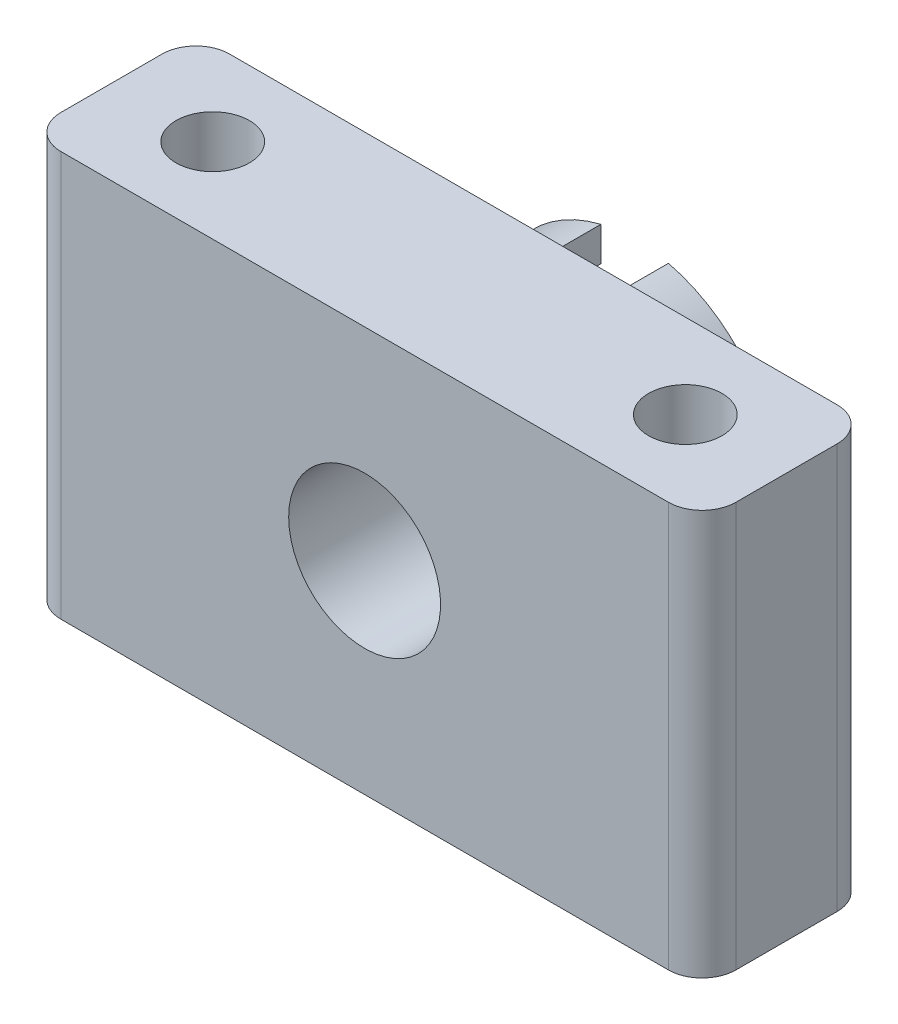
ISO-10303-21;
HEADER;
FILE_DESCRIPTION(('STEP AP214'),'2;1');
FILE_NAME('part.step','',(''),(''),'','','');
FILE_SCHEMA(('AUTOMOTIVE_DESIGN { 1 0 10303 214 1 1 1 1 }'));
ENDSEC;
DATA;
#1=APPLICATION_CONTEXT('core data for automotive mechanical design processes');
#2=APPLICATION_PROTOCOL_DEFINITION('international standard','automotive_design',2000,#1);
#3=PRODUCT_CONTEXT('',#1,'mechanical');
#4=PRODUCT('Part','Part','',(#3));
#5=PRODUCT_RELATED_PRODUCT_CATEGORY('part','',(#4));
#6=PRODUCT_DEFINITION_FORMATION('','',#4);
#7=PRODUCT_DEFINITION_CONTEXT('part definition',#1,'design');
#8=PRODUCT_DEFINITION('design','',#6,#7);
#9=PRODUCT_DEFINITION_SHAPE('','',#8);
#10=(LENGTH_UNIT() NAMED_UNIT(*) SI_UNIT(.MILLI.,.METRE.));
#11=(NAMED_UNIT(*) PLANE_ANGLE_UNIT() SI_UNIT($,.RADIAN.));
#12=(NAMED_UNIT(*) SI_UNIT($,.STERADIAN.) SOLID_ANGLE_UNIT());
#13=UNCERTAINTY_MEASURE_WITH_UNIT(LENGTH_MEASURE(1.E-05),#10,'distance_accuracy_value','');
#14=(GEOMETRIC_REPRESENTATION_CONTEXT(3) GLOBAL_UNCERTAINTY_ASSIGNED_CONTEXT((#13)) GLOBAL_UNIT_ASSIGNED_CONTEXT((#10,
#11,#12)) REPRESENTATION_CONTEXT('',''));
#15=CARTESIAN_POINT('',(0.,0.,0.));
#16=DIRECTION('',(0.,0.,1.));
#17=DIRECTION('',(1.,0.,0.));
#18=AXIS2_PLACEMENT_3D('',#15,#16,#17);
#19=CARTESIAN_POINT('',(0.,0.,0.));
#20=DIRECTION('',(0.,0.,-1.));
#21=DIRECTION('',(-1.,0.,0.));
#22=AXIS2_PLACEMENT_3D('',#19,#20,#21);
#23=PLANE('',#22);
#24=CARTESIAN_POINT('',(0.,0.,0.));
#25=DIRECTION('',(0.,0.,1.));
#26=DIRECTION('',(1.,0.,0.));
#27=AXIS2_PLACEMENT_3D('',#24,#25,#26);
#28=CIRCLE('',#27,6.55);
#29=CARTESIAN_POINT('',(-2.,6.23718686588754,0.));
#30=VERTEX_POINT('',#29);
#31=CARTESIAN_POINT('',(-2.,-6.23718686588753,0.));
#32=VERTEX_POINT('',#31);
#33=EDGE_CURVE('E225',#30,#32,#28,.T.);
#34=ORIENTED_EDGE('',*,*,#33,.T.);
#35=DIRECTION('',(0.,1.,0.));
#36=VECTOR('',#35,1.);
#37=CARTESIAN_POINT('',(-2.,-6.23718686588753,0.));
#38=LINE('',#37,#36);
#39=CARTESIAN_POINT('',(-2.,-8.26135582092915,0.));
#40=VERTEX_POINT('',#39);
#41=EDGE_CURVE('E157',#40,#32,#38,.T.);
#42=ORIENTED_EDGE('',*,*,#41,.F.);
#43=CARTESIAN_POINT('',(0.,0.,0.));
#44=DIRECTION('',(0.,0.,1.));
#45=DIRECTION('',(1.,0.,0.));
#46=AXIS2_PLACEMENT_3D('',#43,#44,#45);
#47=CIRCLE('',#46,8.5);
#48=CARTESIAN_POINT('',(-2.,8.26135582092916,0.));
#49=VERTEX_POINT('',#48);
#50=EDGE_CURVE('E229',#49,#40,#47,.T.);
#51=ORIENTED_EDGE('',*,*,#50,.F.);
#52=DIRECTION('',(0.,1.,0.));
#53=VECTOR('',#52,1.);
#54=CARTESIAN_POINT('',(-2.,8.26135582092916,0.));
#55=LINE('',#54,#53);
#56=EDGE_CURVE('E152',#30,#49,#55,.T.);
#57=ORIENTED_EDGE('',*,*,#56,.F.);
#58=EDGE_LOOP('',(#34,#42,#51,#57));
#59=FACE_BOUND('',#58,.T.);
#60=ADVANCED_FACE('F16',(#59),#23,.T.);
#61=CARTESIAN_POINT('',(0.,0.,0.));
#62=DIRECTION('',(0.,0.,-1.));
#63=DIRECTION('',(-1.,0.,0.));
#64=AXIS2_PLACEMENT_3D('',#61,#62,#63);
#65=PLANE('',#64);
#66=DIRECTION('',(0.,-1.,0.));
#67=VECTOR('',#66,1.);
#68=CARTESIAN_POINT('',(2.,-6.23718686588753,0.));
#69=LINE('',#68,#67);
#70=CARTESIAN_POINT('',(2.,-6.23718686588753,0.));
#71=VERTEX_POINT('',#70);
#72=CARTESIAN_POINT('',(2.,-8.26135582092915,0.));
#73=VERTEX_POINT('',#72);
#74=EDGE_CURVE('E127',#71,#73,#69,.T.);
#75=ORIENTED_EDGE('',*,*,#74,.F.);
#76=CARTESIAN_POINT('',(0.,0.,0.));
#77=DIRECTION('',(0.,0.,1.));
#78=DIRECTION('',(1.,0.,0.));
#79=AXIS2_PLACEMENT_3D('',#76,#77,#78);
#80=CIRCLE('',#79,6.55);
#81=CARTESIAN_POINT('',(2.,6.23718686588754,0.));
#82=VERTEX_POINT('',#81);
#83=EDGE_CURVE('E155',#71,#82,#80,.T.);
#84=ORIENTED_EDGE('',*,*,#83,.T.);
#85=DIRECTION('',(0.,-1.,0.));
#86=VECTOR('',#85,1.);
#87=CARTESIAN_POINT('',(2.,8.26135582092916,0.));
#88=LINE('',#87,#86);
#89=CARTESIAN_POINT('',(2.,8.26135582092916,0.));
#90=VERTEX_POINT('',#89);
#91=EDGE_CURVE('E130',#90,#82,#88,.T.);
#92=ORIENTED_EDGE('',*,*,#91,.F.);
#93=CARTESIAN_POINT('',(0.,0.,0.));
#94=DIRECTION('',(0.,0.,1.));
#95=DIRECTION('',(1.,0.,0.));
#96=AXIS2_PLACEMENT_3D('',#93,#94,#95);
#97=CIRCLE('',#96,8.5);
#98=EDGE_CURVE('E19',#73,#90,#97,.T.);
#99=ORIENTED_EDGE('',*,*,#98,.F.);
#100=EDGE_LOOP('',(#75,#84,#92,#99));
#101=FACE_BOUND('',#100,.T.);
#102=ADVANCED_FACE('F126',(#101),#65,.T.);
#103=CARTESIAN_POINT('',(0.,0.,-2.00000000000003));
#104=DIRECTION('',(0.,0.,1.));
#105=DIRECTION('',(1.,0.,0.));
#106=AXIS2_PLACEMENT_3D('',#103,#104,#105);
#107=CYLINDRICAL_SURFACE('',#106,8.5);
#108=CARTESIAN_POINT('',(0.,0.,6.));
#109=DIRECTION('',(0.,0.,1.));
#110=DIRECTION('',(1.,0.,0.));
#111=AXIS2_PLACEMENT_3D('',#108,#109,#110);
#112=CIRCLE('',#111,8.5);
#113=CARTESIAN_POINT('',(2.,8.26135582092916,6.));
#114=VERTEX_POINT('',#113);
#115=CARTESIAN_POINT('',(2.,-8.26135582092915,6.));
#116=VERTEX_POINT('',#115);
#117=EDGE_CURVE('E144',#114,#116,#112,.F.);
#118=ORIENTED_EDGE('',*,*,#117,.T.);
#119=DIRECTION('',(0.,0.,1.));
#120=VECTOR('',#119,1.);
#121=CARTESIAN_POINT('',(2.,-8.26135582092915,-2.00000000000003));
#122=LINE('',#121,#120);
#123=EDGE_CURVE('E135',#73,#116,#122,.T.);
#124=ORIENTED_EDGE('',*,*,#123,.F.);
#125=ORIENTED_EDGE('',*,*,#98,.T.);
#126=DIRECTION('',(0.,0.,1.));
#127=VECTOR('',#126,1.);
#128=CARTESIAN_POINT('',(2.,8.26135582092916,-2.00000000000003));
#129=LINE('',#128,#127);
#130=EDGE_CURVE('E151',#114,#90,#129,.F.);
#131=ORIENTED_EDGE('',*,*,#130,.F.);
#132=EDGE_LOOP('',(#118,#124,#125,#131));
#133=FACE_BOUND('',#132,.T.);
#134=ADVANCED_FACE('F143',(#133),#107,.T.);
#135=CARTESIAN_POINT('',(2.,-6.23718686588753,-2.00000000000003));
#136=DIRECTION('',(-1.,0.,0.));
#137=DIRECTION('',(0.,-1.,0.));
#138=AXIS2_PLACEMENT_3D('',#135,#136,#137);
#139=PLANE('',#138);
#140=DIRECTION('',(0.,0.,1.));
#141=VECTOR('',#140,1.);
#142=CARTESIAN_POINT('',(2.,-6.23718686588753,-2.00000000000003));
#143=LINE('',#142,#141);
#144=CARTESIAN_POINT('',(2.,-6.23718686588753,6.));
#145=VERTEX_POINT('',#144);
#146=EDGE_CURVE('E140',#145,#71,#143,.F.);
#147=ORIENTED_EDGE('',*,*,#146,.T.);
#148=ORIENTED_EDGE('',*,*,#74,.T.);
#149=ORIENTED_EDGE('',*,*,#123,.T.);
#150=DIRECTION('',(0.,1.,0.));
#151=VECTOR('',#150,1.);
#152=CARTESIAN_POINT('',(2.,0.,6.));
#153=LINE('',#152,#151);
#154=EDGE_CURVE('E219',#116,#145,#153,.T.);
#155=ORIENTED_EDGE('',*,*,#154,.T.);
#156=EDGE_LOOP('',(#147,#148,#149,#155));
#157=FACE_BOUND('',#156,.T.);
#158=ADVANCED_FACE('F137',(#157),#139,.T.);
#159=CARTESIAN_POINT('',(-2.,-6.23718686588753,-2.00000000000003));
#160=DIRECTION('',(1.,0.,0.));
#161=DIRECTION('',(0.,0.,-1.));
#162=AXIS2_PLACEMENT_3D('',#159,#160,#161);
#163=PLANE('',#162);
#164=DIRECTION('',(0.,0.,1.));
#165=VECTOR('',#164,1.);
#166=CARTESIAN_POINT('',(-2.,-8.26135582092915,-2.00000000000003));
#167=LINE('',#166,#165);
#168=CARTESIAN_POINT('',(-2.,-8.26135582092915,6.));
#169=VERTEX_POINT('',#168);
#170=EDGE_CURVE('E159',#40,#169,#167,.T.);
#171=ORIENTED_EDGE('',*,*,#170,.F.);
#172=ORIENTED_EDGE('',*,*,#41,.T.);
#173=DIRECTION('',(0.,0.,-1.));
#174=VECTOR('',#173,1.);
#175=CARTESIAN_POINT('',(-2.,-6.23718686588753,-2.00000000000003));
#176=LINE('',#175,#174);
#177=CARTESIAN_POINT('',(-2.,-6.23718686588753,6.));
#178=VERTEX_POINT('',#177);
#179=EDGE_CURVE('E160',#32,#178,#176,.F.);
#180=ORIENTED_EDGE('',*,*,#179,.T.);
#181=DIRECTION('',(0.,1.,0.));
#182=VECTOR('',#181,1.);
#183=CARTESIAN_POINT('',(-2.,0.,6.));
#184=LINE('',#183,#182);
#185=EDGE_CURVE('E215',#178,#169,#184,.F.);
#186=ORIENTED_EDGE('',*,*,#185,.T.);
#187=EDGE_LOOP('',(#171,#172,#180,#186));
#188=FACE_BOUND('',#187,.T.);
#189=ADVANCED_FACE('F242',(#188),#163,.T.);
#190=CARTESIAN_POINT('',(0.,0.,-2.00000000000003));
#191=DIRECTION('',(0.,0.,1.));
#192=DIRECTION('',(1.,0.,0.));
#193=AXIS2_PLACEMENT_3D('',#190,#191,#192);
#194=CYLINDRICAL_SURFACE('',#193,8.5);
#195=DIRECTION('',(0.,0.,1.));
#196=VECTOR('',#195,1.);
#197=CARTESIAN_POINT('',(-2.,8.26135582092916,-2.00000000000003));
#198=LINE('',#197,#196);
#199=CARTESIAN_POINT('',(-2.,8.26135582092916,6.));
#200=VERTEX_POINT('',#199);
#201=EDGE_CURVE('E156',#49,#200,#198,.T.);
#202=ORIENTED_EDGE('',*,*,#201,.F.);
#203=ORIENTED_EDGE('',*,*,#50,.T.);
#204=ORIENTED_EDGE('',*,*,#170,.T.);
#205=CARTESIAN_POINT('',(0.,0.,6.));
#206=DIRECTION('',(0.,0.,1.));
#207=DIRECTION('',(1.,0.,0.));
#208=AXIS2_PLACEMENT_3D('',#205,#206,#207);
#209=CIRCLE('',#208,8.5);
#210=EDGE_CURVE('E212',#169,#200,#209,.F.);
#211=ORIENTED_EDGE('',*,*,#210,.T.);
#212=EDGE_LOOP('',(#202,#203,#204,#211));
#213=FACE_BOUND('',#212,.T.);
#214=ADVANCED_FACE('F382',(#213),#194,.T.);
#215=CARTESIAN_POINT('',(-2.,8.26135582092916,-2.00000000000003));
#216=DIRECTION('',(1.,0.,0.));
#217=DIRECTION('',(0.,1.,0.));
#218=AXIS2_PLACEMENT_3D('',#215,#216,#217);
#219=PLANE('',#218);
#220=DIRECTION('',(0.,0.,1.));
#221=VECTOR('',#220,1.);
#222=CARTESIAN_POINT('',(-2.,6.23718686588754,-2.00000000000003));
#223=LINE('',#222,#221);
#224=CARTESIAN_POINT('',(-2.,6.23718686588754,6.));
#225=VERTEX_POINT('',#224);
#226=EDGE_CURVE('E228',#225,#30,#223,.F.);
#227=ORIENTED_EDGE('',*,*,#226,.T.);
#228=ORIENTED_EDGE('',*,*,#56,.T.);
#229=ORIENTED_EDGE('',*,*,#201,.T.);
#230=DIRECTION('',(0.,1.,0.));
#231=VECTOR('',#230,1.);
#232=CARTESIAN_POINT('',(-2.,0.,6.));
#233=LINE('',#232,#231);
#234=EDGE_CURVE('E211',#200,#225,#233,.F.);
#235=ORIENTED_EDGE('',*,*,#234,.T.);
#236=EDGE_LOOP('',(#227,#228,#229,#235));
#237=FACE_BOUND('',#236,.T.);
#238=ADVANCED_FACE('F265',(#237),#219,.T.);
#239=CARTESIAN_POINT('',(0.,0.,-2.00000000000003));
#240=DIRECTION('',(0.,0.,1.));
#241=DIRECTION('',(1.,0.,0.));
#242=AXIS2_PLACEMENT_3D('',#239,#240,#241);
#243=CYLINDRICAL_SURFACE('',#242,6.55);
#244=ORIENTED_EDGE('',*,*,#83,.F.);
#245=ORIENTED_EDGE('',*,*,#146,.F.);
#246=CARTESIAN_POINT('',(0.,0.,6.));
#247=DIRECTION('',(0.,0.,1.));
#248=DIRECTION('',(1.,0.,0.));
#249=AXIS2_PLACEMENT_3D('',#246,#247,#248);
#250=CIRCLE('',#249,6.55);
#251=EDGE_CURVE('E216',#145,#178,#250,.F.);
#252=ORIENTED_EDGE('',*,*,#251,.T.);
#253=ORIENTED_EDGE('',*,*,#179,.F.);
#254=ORIENTED_EDGE('',*,*,#33,.F.);
#255=ORIENTED_EDGE('',*,*,#226,.F.);
#256=CARTESIAN_POINT('',(0.,0.,6.));
#257=DIRECTION('',(0.,0.,1.));
#258=DIRECTION('',(1.,0.,0.));
#259=AXIS2_PLACEMENT_3D('',#256,#257,#258);
#260=CIRCLE('',#259,6.55);
#261=CARTESIAN_POINT('',(2.,6.23718686588754,6.));
#262=VERTEX_POINT('',#261);
#263=EDGE_CURVE('E208',#225,#262,#260,.F.);
#264=ORIENTED_EDGE('',*,*,#263,.T.);
#265=DIRECTION('',(0.,0.,1.));
#266=VECTOR('',#265,1.);
#267=CARTESIAN_POINT('',(2.,6.23718686588754,-2.00000000000003));
#268=LINE('',#267,#266);
#269=EDGE_CURVE('E227',#82,#262,#268,.T.);
#270=ORIENTED_EDGE('',*,*,#269,.F.);
#271=EDGE_LOOP('',(#244,#245,#252,#253,#254,#255,#264,#270));
#272=FACE_BOUND('',#271,.T.);
#273=CARTESIAN_POINT('',(0.,0.,9.));
#274=DIRECTION('',(0.,0.,1.));
#275=DIRECTION('',(1.,0.,0.));
#276=AXIS2_PLACEMENT_3D('',#273,#274,#275);
#277=CIRCLE('',#276,6.55);
#278=CARTESIAN_POINT('',(6.54999999999999,0.,9.));
#279=VERTEX_POINT('',#278);
#280=EDGE_CURVE('E150',#279,#279,#277,.F.);
#281=ORIENTED_EDGE('',*,*,#280,.F.);
#282=EDGE_LOOP('',(#281));
#283=FACE_BOUND('',#282,.T.);
#284=ADVANCED_FACE('F252',(#272,#283),#243,.F.);
#285=CARTESIAN_POINT('',(2.,8.26135582092916,-2.00000000000003));
#286=DIRECTION('',(-1.,0.,0.));
#287=DIRECTION('',(0.,-1.,0.));
#288=AXIS2_PLACEMENT_3D('',#285,#286,#287);
#289=PLANE('',#288);
#290=ORIENTED_EDGE('',*,*,#130,.T.);
#291=ORIENTED_EDGE('',*,*,#91,.T.);
#292=ORIENTED_EDGE('',*,*,#269,.T.);
#293=DIRECTION('',(0.,1.,0.));
#294=VECTOR('',#293,1.);
#295=CARTESIAN_POINT('',(2.,0.,6.));
#296=LINE('',#295,#294);
#297=EDGE_CURVE('E207',#262,#114,#296,.T.);
#298=ORIENTED_EDGE('',*,*,#297,.T.);
#299=EDGE_LOOP('',(#290,#291,#292,#298));
#300=FACE_BOUND('',#299,.T.);
#301=ADVANCED_FACE('F256',(#300),#289,.T.);
#302=CARTESIAN_POINT('',(0.,0.,9.));
#303=DIRECTION('',(0.,0.,-1.));
#304=DIRECTION('',(-1.,0.,0.));
#305=AXIS2_PLACEMENT_3D('',#302,#303,#304);
#306=PLANE('',#305);
#307=ORIENTED_EDGE('',*,*,#280,.T.);
#308=EDGE_LOOP('',(#307));
#309=FACE_BOUND('',#308,.T.);
#310=CARTESIAN_POINT('',(0.,0.,9.));
#311=DIRECTION('',(0.,0.,-1.));
#312=DIRECTION('',(-1.,0.,0.));
#313=AXIS2_PLACEMENT_3D('',#310,#311,#312);
#314=CIRCLE('',#313,4.5);
#315=CARTESIAN_POINT('',(-4.5,0.,9.));
#316=VERTEX_POINT('',#315);
#317=EDGE_CURVE('E204',#316,#316,#314,.F.);
#318=ORIENTED_EDGE('',*,*,#317,.T.);
#319=EDGE_LOOP('',(#318));
#320=FACE_BOUND('',#319,.T.);
#321=ADVANCED_FACE('F363',(#309,#320),#306,.T.);
#322=CARTESIAN_POINT('',(-14.,-28.,11.));
#323=DIRECTION('',(0.,1.,0.));
#324=DIRECTION('',(0.,0.,1.));
#325=AXIS2_PLACEMENT_3D('',#322,#323,#324);
#326=CYLINDRICAL_SURFACE('',#325,2.175);
#327=CARTESIAN_POINT('',(-14.,-12.,11.));
#328=DIRECTION('',(0.,1.,0.));
#329=DIRECTION('',(0.,0.,1.));
#330=AXIS2_PLACEMENT_3D('',#327,#328,#329);
#331=CIRCLE('',#330,2.175);
#332=CARTESIAN_POINT('',(-14.,-12.,13.175));
#333=VERTEX_POINT('',#332);
#334=EDGE_CURVE('E182',#333,#333,#331,.F.);
#335=ORIENTED_EDGE('',*,*,#334,.T.);
#336=EDGE_LOOP('',(#335));
#337=FACE_BOUND('',#336,.T.);
#338=CARTESIAN_POINT('',(-14.,12.,11.));
#339=DIRECTION('',(0.,1.,0.));
#340=DIRECTION('',(0.,0.,1.));
#341=AXIS2_PLACEMENT_3D('',#338,#339,#340);
#342=CIRCLE('',#341,2.175);
#343=CARTESIAN_POINT('',(-14.,12.,13.175));
#344=VERTEX_POINT('',#343);
#345=EDGE_CURVE('E200',#344,#344,#342,.F.);
#346=ORIENTED_EDGE('',*,*,#345,.F.);
#347=EDGE_LOOP('',(#346));
#348=FACE_BOUND('',#347,.T.);
#349=ADVANCED_FACE('F365',(#337,#348),#326,.F.);
#350=CARTESIAN_POINT('',(14.,-28.,11.));
#351=DIRECTION('',(0.,1.,0.));
#352=DIRECTION('',(0.,0.,1.));
#353=AXIS2_PLACEMENT_3D('',#350,#351,#352);
#354=CYLINDRICAL_SURFACE('',#353,2.175);
#355=CARTESIAN_POINT('',(14.,-12.,11.));
#356=DIRECTION('',(0.,1.,0.));
#357=DIRECTION('',(0.,0.,1.));
#358=AXIS2_PLACEMENT_3D('',#355,#356,#357);
#359=CIRCLE('',#358,2.175);
#360=CARTESIAN_POINT('',(14.,-12.,13.175));
#361=VERTEX_POINT('',#360);
#362=EDGE_CURVE('E179',#361,#361,#359,.F.);
#363=ORIENTED_EDGE('',*,*,#362,.T.);
#364=EDGE_LOOP('',(#363));
#365=FACE_BOUND('',#364,.T.);
#366=CARTESIAN_POINT('',(14.,12.,11.));
#367=DIRECTION('',(0.,1.,0.));
#368=DIRECTION('',(0.,0.,1.));
#369=AXIS2_PLACEMENT_3D('',#366,#367,#368);
#370=CIRCLE('',#369,2.175);
#371=CARTESIAN_POINT('',(14.,12.,13.175));
#372=VERTEX_POINT('',#371);
#373=EDGE_CURVE('E197',#372,#372,#370,.F.);
#374=ORIENTED_EDGE('',*,*,#373,.F.);
#375=EDGE_LOOP('',(#374));
#376=FACE_BOUND('',#375,.T.);
#377=ADVANCED_FACE('F372',(#365,#376),#354,.F.);
#378=CARTESIAN_POINT('',(-18.,12.,8.));
#379=DIRECTION('',(0.,-1.,0.));
#380=DIRECTION('',(1.,0.,0.));
#381=AXIS2_PLACEMENT_3D('',#378,#379,#380);
#382=CYLINDRICAL_SURFACE('',#381,2.);
#383=CARTESIAN_POINT('',(-18.,-12.,8.));
#384=DIRECTION('',(0.,-1.,0.));
#385=DIRECTION('',(1.,0.,0.));
#386=AXIS2_PLACEMENT_3D('',#383,#384,#385);
#387=CIRCLE('',#386,2.);
#388=CARTESIAN_POINT('',(-18.,-12.,6.));
#389=VERTEX_POINT('',#388);
#390=CARTESIAN_POINT('',(-20.,-12.,8.));
#391=VERTEX_POINT('',#390);
#392=EDGE_CURVE('E176',#389,#391,#387,.F.);
#393=ORIENTED_EDGE('',*,*,#392,.T.);
#394=DIRECTION('',(0.,1.,0.));
#395=VECTOR('',#394,1.);
#396=CARTESIAN_POINT('',(-20.,12.,8.));
#397=LINE('',#396,#395);
#398=CARTESIAN_POINT('',(-20.,12.,8.));
#399=VERTEX_POINT('',#398);
#400=EDGE_CURVE('E224',#391,#399,#397,.T.);
#401=ORIENTED_EDGE('',*,*,#400,.T.);
#402=CARTESIAN_POINT('',(-18.,12.,8.));
#403=DIRECTION('',(0.,-1.,0.));
#404=DIRECTION('',(1.,0.,0.));
#405=AXIS2_PLACEMENT_3D('',#402,#403,#404);
#406=CIRCLE('',#405,2.);
#407=CARTESIAN_POINT('',(-18.,12.,6.));
#408=VERTEX_POINT('',#407);
#409=EDGE_CURVE('E191',#408,#399,#406,.F.);
#410=ORIENTED_EDGE('',*,*,#409,.F.);
#411=DIRECTION('',(0.,1.,0.));
#412=VECTOR('',#411,1.);
#413=CARTESIAN_POINT('',(-18.,0.,6.));
#414=LINE('',#413,#412);
#415=EDGE_CURVE('E274',#408,#389,#414,.F.);
#416=ORIENTED_EDGE('',*,*,#415,.T.);
#417=EDGE_LOOP('',(#393,#401,#410,#416));
#418=FACE_BOUND('',#417,.T.);
#419=ADVANCED_FACE('F286',(#418),#382,.T.);
#420=CARTESIAN_POINT('',(-20.,12.,16.));
#421=DIRECTION('',(1.,0.,0.));
#422=DIRECTION('',(0.,1.,0.));
#423=AXIS2_PLACEMENT_3D('',#420,#421,#422);
#424=PLANE('',#423);
#425=ORIENTED_EDGE('',*,*,#400,.F.);
#426=DIRECTION('',(0.,0.,1.));
#427=VECTOR('',#426,1.);
#428=CARTESIAN_POINT('',(-20.,-12.,16.));
#429=LINE('',#428,#427);
#430=CARTESIAN_POINT('',(-20.,-12.,14.));
#431=VERTEX_POINT('',#430);
#432=EDGE_CURVE('E175',#391,#431,#429,.T.);
#433=ORIENTED_EDGE('',*,*,#432,.T.);
#434=DIRECTION('',(0.,-1.,0.));
#435=VECTOR('',#434,1.);
#436=CARTESIAN_POINT('',(-20.,0.,14.));
#437=LINE('',#436,#435);
#438=CARTESIAN_POINT('',(-20.,12.,14.));
#439=VERTEX_POINT('',#438);
#440=EDGE_CURVE('E203',#439,#431,#437,.T.);
#441=ORIENTED_EDGE('',*,*,#440,.F.);
#442=DIRECTION('',(0.,0.,1.));
#443=VECTOR('',#442,1.);
#444=CARTESIAN_POINT('',(-20.,12.,16.));
#445=LINE('',#444,#443);
#446=EDGE_CURVE('E190',#399,#439,#445,.T.);
#447=ORIENTED_EDGE('',*,*,#446,.F.);
#448=EDGE_LOOP('',(#425,#433,#441,#447));
#449=FACE_BOUND('',#448,.T.);
#450=ADVANCED_FACE('F291',(#449),#424,.F.);
#451=CARTESIAN_POINT('',(20.,12.,16.));
#452=DIRECTION('',(1.,0.,0.));
#453=DIRECTION('',(0.,1.,0.));
#454=AXIS2_PLACEMENT_3D('',#451,#452,#453);
#455=PLANE('',#454);
#456=DIRECTION('',(0.,0.,1.));
#457=VECTOR('',#456,1.);
#458=CARTESIAN_POINT('',(20.,12.,16.));
#459=LINE('',#458,#457);
#460=CARTESIAN_POINT('',(20.,12.,14.));
#461=VERTEX_POINT('',#460);
#462=CARTESIAN_POINT('',(20.,12.,8.));
#463=VERTEX_POINT('',#462);
#464=EDGE_CURVE('E196',#461,#463,#459,.F.);
#465=ORIENTED_EDGE('',*,*,#464,.F.);
#466=DIRECTION('',(0.,1.,0.));
#467=VECTOR('',#466,1.);
#468=CARTESIAN_POINT('',(20.,12.,14.));
#469=LINE('',#468,#467);
#470=CARTESIAN_POINT('',(20.,-12.,14.));
#471=VERTEX_POINT('',#470);
#472=EDGE_CURVE('E185',#471,#461,#469,.T.);
#473=ORIENTED_EDGE('',*,*,#472,.F.);
#474=DIRECTION('',(0.,0.,1.));
#475=VECTOR('',#474,1.);
#476=CARTESIAN_POINT('',(20.,-12.,16.));
#477=LINE('',#476,#475);
#478=CARTESIAN_POINT('',(20.,-12.,8.));
#479=VERTEX_POINT('',#478);
#480=EDGE_CURVE('E170',#471,#479,#477,.F.);
#481=ORIENTED_EDGE('',*,*,#480,.T.);
#482=DIRECTION('',(0.,-1.,0.));
#483=VECTOR('',#482,1.);
#484=CARTESIAN_POINT('',(20.,12.,8.));
#485=LINE('',#484,#483);
#486=EDGE_CURVE('E277',#463,#479,#485,.T.);
#487=ORIENTED_EDGE('',*,*,#486,.F.);
#488=EDGE_LOOP('',(#465,#473,#481,#487));
#489=FACE_BOUND('',#488,.T.);
#490=ADVANCED_FACE('F325',(#489),#455,.T.);
#491=CARTESIAN_POINT('',(18.,12.,8.));
#492=DIRECTION('',(0.,-1.,0.));
#493=DIRECTION('',(1.,0.,0.));
#494=AXIS2_PLACEMENT_3D('',#491,#492,#493);
#495=CYLINDRICAL_SURFACE('',#494,2.);
#496=CARTESIAN_POINT('',(18.,12.,8.));
#497=DIRECTION('',(0.,-1.,0.));
#498=DIRECTION('',(1.,0.,0.));
#499=AXIS2_PLACEMENT_3D('',#496,#497,#498);
#500=CIRCLE('',#499,2.);
#501=CARTESIAN_POINT('',(18.,12.,6.));
#502=VERTEX_POINT('',#501);
#503=EDGE_CURVE('E194',#463,#502,#500,.F.);
#504=ORIENTED_EDGE('',*,*,#503,.F.);
#505=ORIENTED_EDGE('',*,*,#486,.T.);
#506=CARTESIAN_POINT('',(18.,-12.,8.));
#507=DIRECTION('',(0.,-1.,0.));
#508=DIRECTION('',(1.,0.,0.));
#509=AXIS2_PLACEMENT_3D('',#506,#507,#508);
#510=CIRCLE('',#509,2.);
#511=CARTESIAN_POINT('',(18.,-12.,6.));
#512=VERTEX_POINT('',#511);
#513=EDGE_CURVE('E167',#479,#512,#510,.F.);
#514=ORIENTED_EDGE('',*,*,#513,.T.);
#515=DIRECTION('',(0.,1.,0.));
#516=VECTOR('',#515,1.);
#517=CARTESIAN_POINT('',(18.,0.,6.));
#518=LINE('',#517,#516);
#519=EDGE_CURVE('E221',#512,#502,#518,.T.);
#520=ORIENTED_EDGE('',*,*,#519,.T.);
#521=EDGE_LOOP('',(#504,#505,#514,#520));
#522=FACE_BOUND('',#521,.T.);
#523=ADVANCED_FACE('F330',(#522),#495,.T.);
#524=CARTESIAN_POINT('',(0.,0.,6.));
#525=DIRECTION('',(0.,0.,1.));
#526=DIRECTION('',(1.,0.,0.));
#527=AXIS2_PLACEMENT_3D('',#524,#525,#526);
#528=PLANE('',#527);
#529=ORIENTED_EDGE('',*,*,#263,.F.);
#530=ORIENTED_EDGE('',*,*,#234,.F.);
#531=ORIENTED_EDGE('',*,*,#210,.F.);
#532=ORIENTED_EDGE('',*,*,#185,.F.);
#533=ORIENTED_EDGE('',*,*,#251,.F.);
#534=ORIENTED_EDGE('',*,*,#154,.F.);
#535=ORIENTED_EDGE('',*,*,#117,.F.);
#536=ORIENTED_EDGE('',*,*,#297,.F.);
#537=EDGE_LOOP('',(#529,#530,#531,#532,#533,#534,#535,#536));
#538=FACE_BOUND('',#537,.T.);
#539=ORIENTED_EDGE('',*,*,#519,.F.);
#540=DIRECTION('',(1.,0.,0.));
#541=VECTOR('',#540,1.);
#542=CARTESIAN_POINT('',(-20.,-12.,6.));
#543=LINE('',#542,#541);
#544=EDGE_CURVE('E166',#512,#389,#543,.F.);
#545=ORIENTED_EDGE('',*,*,#544,.T.);
#546=ORIENTED_EDGE('',*,*,#415,.F.);
#547=DIRECTION('',(-1.,0.,0.));
#548=VECTOR('',#547,1.);
#549=CARTESIAN_POINT('',(-20.,12.,6.));
#550=LINE('',#549,#548);
#551=EDGE_CURVE('E193',#502,#408,#550,.T.);
#552=ORIENTED_EDGE('',*,*,#551,.F.);
#553=EDGE_LOOP('',(#539,#545,#546,#552));
#554=FACE_BOUND('',#553,.T.);
#555=ADVANCED_FACE('F248',(#538,#554),#528,.F.);
#556=CARTESIAN_POINT('',(0.,0.,18.));
#557=DIRECTION('',(0.,0.,-1.));
#558=DIRECTION('',(-1.,0.,0.));
#559=AXIS2_PLACEMENT_3D('',#556,#557,#558);
#560=CYLINDRICAL_SURFACE('',#559,4.5);
#561=CARTESIAN_POINT('',(0.,0.,16.));
#562=DIRECTION('',(0.,0.,-1.));
#563=DIRECTION('',(-1.,0.,0.));
#564=AXIS2_PLACEMENT_3D('',#561,#562,#563);
#565=CIRCLE('',#564,4.5);
#566=CARTESIAN_POINT('',(-4.5,0.,16.));
#567=VERTEX_POINT('',#566);
#568=EDGE_CURVE('E162',#567,#567,#565,.F.);
#569=ORIENTED_EDGE('',*,*,#568,.T.);
#570=EDGE_LOOP('',(#569));
#571=FACE_BOUND('',#570,.T.);
#572=ORIENTED_EDGE('',*,*,#317,.F.);
#573=EDGE_LOOP('',(#572));
#574=FACE_BOUND('',#573,.T.);
#575=ADVANCED_FACE('F338',(#571,#574),#560,.F.);
#576=CARTESIAN_POINT('',(-18.,0.,14.));
#577=DIRECTION('',(0.,-1.,0.));
#578=DIRECTION('',(1.,0.,0.));
#579=AXIS2_PLACEMENT_3D('',#576,#577,#578);
#580=CYLINDRICAL_SURFACE('',#579,2.);
#581=CARTESIAN_POINT('',(-18.,-12.,14.));
#582=DIRECTION('',(0.,-1.,0.));
#583=DIRECTION('',(1.,0.,0.));
#584=AXIS2_PLACEMENT_3D('',#581,#582,#583);
#585=CIRCLE('',#584,2.);
#586=CARTESIAN_POINT('',(-18.,-12.,16.));
#587=VERTEX_POINT('',#586);
#588=EDGE_CURVE('E172',#431,#587,#585,.F.);
#589=ORIENTED_EDGE('',*,*,#588,.T.);
#590=DIRECTION('',(0.,1.,0.));
#591=VECTOR('',#590,1.);
#592=CARTESIAN_POINT('',(-18.,0.,16.));
#593=LINE('',#592,#591);
#594=CARTESIAN_POINT('',(-18.,12.,16.));
#595=VERTEX_POINT('',#594);
#596=EDGE_CURVE('E165',#587,#595,#593,.T.);
#597=ORIENTED_EDGE('',*,*,#596,.T.);
#598=CARTESIAN_POINT('',(-18.,12.,14.));
#599=DIRECTION('',(0.,-1.,0.));
#600=DIRECTION('',(1.,0.,0.));
#601=AXIS2_PLACEMENT_3D('',#598,#599,#600);
#602=CIRCLE('',#601,2.);
#603=EDGE_CURVE('E188',#439,#595,#602,.F.);
#604=ORIENTED_EDGE('',*,*,#603,.F.);
#605=ORIENTED_EDGE('',*,*,#440,.T.);
#606=EDGE_LOOP('',(#589,#597,#604,#605));
#607=FACE_BOUND('',#606,.T.);
#608=ADVANCED_FACE('F352',(#607),#580,.T.);
#609=CARTESIAN_POINT('',(-20.,12.,16.));
#610=DIRECTION('',(0.,1.,0.));
#611=DIRECTION('',(-1.,0.,0.));
#612=AXIS2_PLACEMENT_3D('',#609,#610,#611);
#613=PLANE('',#612);
#614=DIRECTION('',(-1.,0.,0.));
#615=VECTOR('',#614,1.);
#616=CARTESIAN_POINT('',(0.,12.,16.));
#617=LINE('',#616,#615);
#618=CARTESIAN_POINT('',(18.,12.,16.));
#619=VERTEX_POINT('',#618);
#620=EDGE_CURVE('E296',#595,#619,#617,.F.);
#621=ORIENTED_EDGE('',*,*,#620,.T.);
#622=CARTESIAN_POINT('',(18.,12.,14.));
#623=DIRECTION('',(0.,1.,0.));
#624=DIRECTION('',(-1.,0.,0.));
#625=AXIS2_PLACEMENT_3D('',#622,#623,#624);
#626=CIRCLE('',#625,2.);
#627=EDGE_CURVE('E186',#461,#619,#626,.F.);
#628=ORIENTED_EDGE('',*,*,#627,.F.);
#629=ORIENTED_EDGE('',*,*,#464,.T.);
#630=ORIENTED_EDGE('',*,*,#503,.T.);
#631=ORIENTED_EDGE('',*,*,#551,.T.);
#632=ORIENTED_EDGE('',*,*,#409,.T.);
#633=ORIENTED_EDGE('',*,*,#446,.T.);
#634=ORIENTED_EDGE('',*,*,#603,.T.);
#635=EDGE_LOOP('',(#621,#628,#629,#630,#631,#632,#633,#634));
#636=FACE_BOUND('',#635,.T.);
#637=ORIENTED_EDGE('',*,*,#373,.T.);
#638=EDGE_LOOP('',(#637));
#639=FACE_BOUND('',#638,.T.);
#640=ORIENTED_EDGE('',*,*,#345,.T.);
#641=EDGE_LOOP('',(#640));
#642=FACE_BOUND('',#641,.T.);
#643=ADVANCED_FACE('F301',(#636,#639,#642),#613,.T.);
#644=CARTESIAN_POINT('',(18.,12.,14.));
#645=DIRECTION('',(0.,1.,0.));
#646=DIRECTION('',(-1.,0.,0.));
#647=AXIS2_PLACEMENT_3D('',#644,#645,#646);
#648=CYLINDRICAL_SURFACE('',#647,2.);
#649=CARTESIAN_POINT('',(18.,-12.,14.));
#650=DIRECTION('',(0.,1.,0.));
#651=DIRECTION('',(-1.,0.,0.));
#652=AXIS2_PLACEMENT_3D('',#649,#650,#651);
#653=CIRCLE('',#652,2.);
#654=CARTESIAN_POINT('',(18.,-12.,16.));
#655=VERTEX_POINT('',#654);
#656=EDGE_CURVE('E33',#655,#471,#653,.T.);
#657=ORIENTED_EDGE('',*,*,#656,.T.);
#658=ORIENTED_EDGE('',*,*,#472,.T.);
#659=ORIENTED_EDGE('',*,*,#627,.T.);
#660=DIRECTION('',(0.,1.,0.));
#661=VECTOR('',#660,1.);
#662=CARTESIAN_POINT('',(18.,0.,16.));
#663=LINE('',#662,#661);
#664=EDGE_CURVE('E25',#619,#655,#663,.F.);
#665=ORIENTED_EDGE('',*,*,#664,.T.);
#666=EDGE_LOOP('',(#657,#658,#659,#665));
#667=FACE_BOUND('',#666,.T.);
#668=ADVANCED_FACE('F323',(#667),#648,.T.);
#669=CARTESIAN_POINT('',(-20.,-12.,16.));
#670=DIRECTION('',(0.,1.,0.));
#671=DIRECTION('',(0.,0.,1.));
#672=AXIS2_PLACEMENT_3D('',#669,#670,#671);
#673=PLANE('',#672);
#674=ORIENTED_EDGE('',*,*,#513,.F.);
#675=ORIENTED_EDGE('',*,*,#480,.F.);
#676=ORIENTED_EDGE('',*,*,#656,.F.);
#677=DIRECTION('',(-1.,0.,0.));
#678=VECTOR('',#677,1.);
#679=CARTESIAN_POINT('',(0.,-12.,16.));
#680=LINE('',#679,#678);
#681=EDGE_CURVE('E11',#655,#587,#680,.T.);
#682=ORIENTED_EDGE('',*,*,#681,.T.);
#683=ORIENTED_EDGE('',*,*,#588,.F.);
#684=ORIENTED_EDGE('',*,*,#432,.F.);
#685=ORIENTED_EDGE('',*,*,#392,.F.);
#686=ORIENTED_EDGE('',*,*,#544,.F.);
#687=EDGE_LOOP('',(#674,#675,#676,#682,#683,#684,#685,#686));
#688=FACE_BOUND('',#687,.T.);
#689=ORIENTED_EDGE('',*,*,#362,.F.);
#690=EDGE_LOOP('',(#689));
#691=FACE_BOUND('',#690,.T.);
#692=ORIENTED_EDGE('',*,*,#334,.F.);
#693=EDGE_LOOP('',(#692));
#694=FACE_BOUND('',#693,.T.);
#695=ADVANCED_FACE('F327',(#688,#691,#694),#673,.F.);
#696=CARTESIAN_POINT('',(0.,0.,16.));
#697=DIRECTION('',(0.,0.,-1.));
#698=DIRECTION('',(-1.,0.,0.));
#699=AXIS2_PLACEMENT_3D('',#696,#697,#698);
#700=PLANE('',#699);
#701=ORIENTED_EDGE('',*,*,#664,.F.);
#702=ORIENTED_EDGE('',*,*,#620,.F.);
#703=ORIENTED_EDGE('',*,*,#596,.F.);
#704=ORIENTED_EDGE('',*,*,#681,.F.);
#705=EDGE_LOOP('',(#701,#702,#703,#704));
#706=FACE_BOUND('',#705,.T.);
#707=ORIENTED_EDGE('',*,*,#568,.F.);
#708=EDGE_LOOP('',(#707));
#709=FACE_BOUND('',#708,.T.);
#710=ADVANCED_FACE('F320',(#706,#709),#700,.F.);
#711=CLOSED_SHELL('',(#60,#102,#134,#158,#189,#214,#238,#284,#301,#321,#349,#377,#419,#450,#490,
#523,#555,#575,#608,#643,#668,#695,#710));
#712=MANIFOLD_SOLID_BREP('B1',#711);
#713=ADVANCED_BREP_SHAPE_REPRESENTATION('',(#18,#712),#14);
#714=SHAPE_DEFINITION_REPRESENTATION(#9,#713);
ENDSEC;
END-ISO-10303-21;
